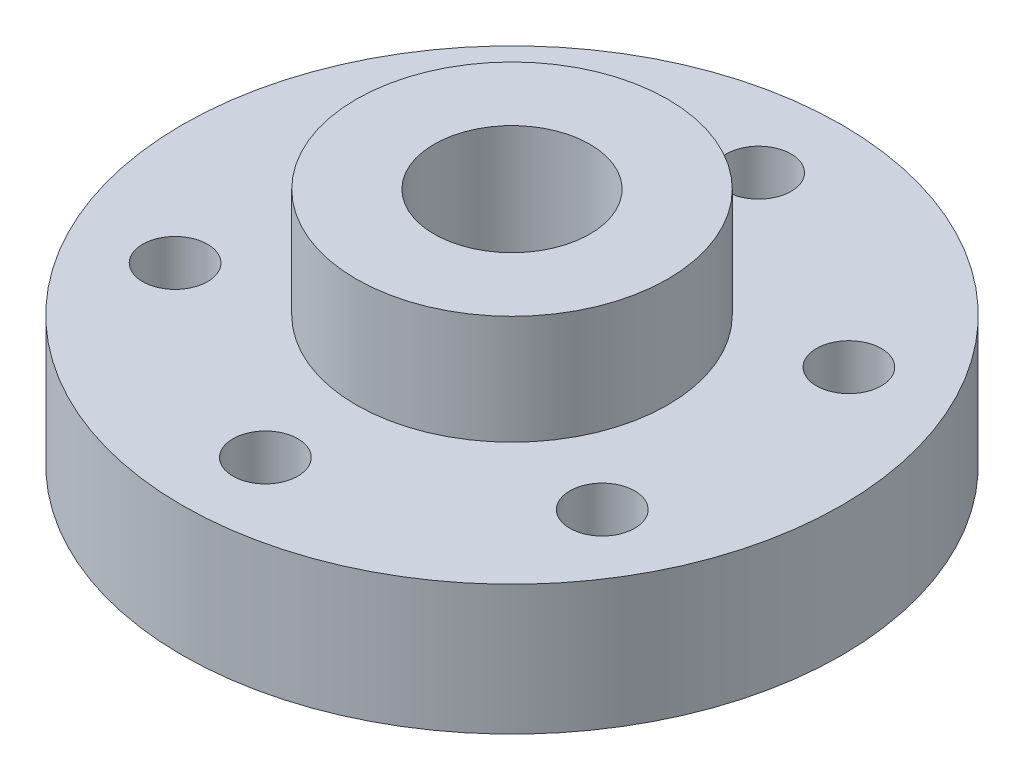
ISO-10303-21;
HEADER;
FILE_DESCRIPTION(('STEP AP214'),'2;1');
FILE_NAME('part.step','',(''),(''),'','','');
FILE_SCHEMA(('AUTOMOTIVE_DESIGN { 1 0 10303 214 1 1 1 1 }'));
ENDSEC;
DATA;
#1=APPLICATION_CONTEXT('core data for automotive mechanical design processes');
#2=APPLICATION_PROTOCOL_DEFINITION('international standard','automotive_design',2000,#1);
#3=PRODUCT_CONTEXT('',#1,'mechanical');
#4=PRODUCT('Part','Part','',(#3));
#5=PRODUCT_RELATED_PRODUCT_CATEGORY('part','',(#4));
#6=PRODUCT_DEFINITION_FORMATION('','',#4);
#7=PRODUCT_DEFINITION_CONTEXT('part definition',#1,'design');
#8=PRODUCT_DEFINITION('design','',#6,#7);
#9=PRODUCT_DEFINITION_SHAPE('','',#8);
#10=(LENGTH_UNIT() NAMED_UNIT(*) SI_UNIT(.MILLI.,.METRE.));
#11=(NAMED_UNIT(*) PLANE_ANGLE_UNIT() SI_UNIT($,.RADIAN.));
#12=(NAMED_UNIT(*) SI_UNIT($,.STERADIAN.) SOLID_ANGLE_UNIT());
#13=UNCERTAINTY_MEASURE_WITH_UNIT(LENGTH_MEASURE(1.E-05),#10,'distance_accuracy_value','');
#14=(GEOMETRIC_REPRESENTATION_CONTEXT(3) GLOBAL_UNCERTAINTY_ASSIGNED_CONTEXT((#13)) GLOBAL_UNIT_ASSIGNED_CONTEXT((#10,
#11,#12)) REPRESENTATION_CONTEXT('',''));
#15=CARTESIAN_POINT('',(0.,0.,0.));
#16=DIRECTION('',(0.,0.,1.));
#17=DIRECTION('',(1.,0.,0.));
#18=AXIS2_PLACEMENT_3D('',#15,#16,#17);
#19=CARTESIAN_POINT('',(0.,0.,0.));
#20=DIRECTION('',(0.,1.,0.));
#21=DIRECTION('',(0.,0.,1.));
#22=AXIS2_PLACEMENT_3D('',#19,#20,#21);
#23=PLANE('',#22);
#24=CARTESIAN_POINT('',(-8.2272413359519,0.,4.74999999999953));
#25=DIRECTION('',(0.,-1.,0.));
#26=DIRECTION('',(0.,0.,-1.));
#27=AXIS2_PLACEMENT_3D('',#24,#25,#26);
#28=CIRCLE('',#27,1.25000000000051);
#29=CARTESIAN_POINT('',(-8.2272413359519,0.,3.49999999999902));
#30=VERTEX_POINT('',#29);
#31=EDGE_CURVE('E75',#30,#30,#28,.T.);
#32=ORIENTED_EDGE('',*,*,#31,.F.);
#33=EDGE_LOOP('',(#32));
#34=FACE_BOUND('',#33,.T.);
#35=CARTESIAN_POINT('',(-8.22724133595136,0.,-4.75000000000047));
#36=DIRECTION('',(0.,-1.,0.));
#37=DIRECTION('',(0.,0.,-1.));
#38=AXIS2_PLACEMENT_3D('',#35,#36,#37);
#39=CIRCLE('',#38,1.250000000001);
#40=CARTESIAN_POINT('',(-8.22724133595136,0.,-6.00000000000147));
#41=VERTEX_POINT('',#40);
#42=EDGE_CURVE('E65',#41,#41,#39,.T.);
#43=ORIENTED_EDGE('',*,*,#42,.F.);
#44=EDGE_LOOP('',(#43));
#45=FACE_BOUND('',#44,.T.);
#46=CARTESIAN_POINT('',(1.07769812943697E-12,0.,-9.5));
#47=DIRECTION('',(0.,-1.,0.));
#48=DIRECTION('',(0.,0.,-1.));
#49=AXIS2_PLACEMENT_3D('',#46,#47,#48);
#50=CIRCLE('',#49,1.25000000000109);
#51=CARTESIAN_POINT('',(1.07769812943697E-12,0.,-10.7500000000011));
#52=VERTEX_POINT('',#51);
#53=EDGE_CURVE('E62',#52,#52,#50,.T.);
#54=ORIENTED_EDGE('',*,*,#53,.F.);
#55=EDGE_LOOP('',(#54));
#56=FACE_BOUND('',#55,.T.);
#57=CARTESIAN_POINT('',(8.22724133595298,0.,-4.74999999999953));
#58=DIRECTION('',(0.,-1.,0.));
#59=DIRECTION('',(0.,0.,-1.));
#60=AXIS2_PLACEMENT_3D('',#57,#58,#59);
#61=CIRCLE('',#60,1.25000000000068);
#62=CARTESIAN_POINT('',(8.22724133595298,0.,-6.00000000000021));
#63=VERTEX_POINT('',#62);
#64=EDGE_CURVE('E59',#63,#63,#61,.T.);
#65=ORIENTED_EDGE('',*,*,#64,.F.);
#66=EDGE_LOOP('',(#65));
#67=FACE_BOUND('',#66,.T.);
#68=CARTESIAN_POINT('',(8.22724133595243,0.,4.75000000000047));
#69=DIRECTION('',(0.,-1.,0.));
#70=DIRECTION('',(0.,0.,-1.));
#71=AXIS2_PLACEMENT_3D('',#68,#69,#70);
#72=CIRCLE('',#71,1.25000000000014);
#73=CARTESIAN_POINT('',(8.22724133595243,0.,3.50000000000032));
#74=VERTEX_POINT('',#73);
#75=EDGE_CURVE('E55',#74,#74,#72,.T.);
#76=ORIENTED_EDGE('',*,*,#75,.F.);
#77=EDGE_LOOP('',(#76));
#78=FACE_BOUND('',#77,.T.);
#79=CARTESIAN_POINT('',(0.,0.,9.5));
#80=DIRECTION('',(0.,-1.,0.));
#81=DIRECTION('',(0.,0.,-1.));
#82=AXIS2_PLACEMENT_3D('',#79,#80,#81);
#83=CIRCLE('',#82,1.25);
#84=CARTESIAN_POINT('',(0.,0.,8.25));
#85=VERTEX_POINT('',#84);
#86=EDGE_CURVE('E51',#85,#85,#83,.T.);
#87=ORIENTED_EDGE('',*,*,#86,.F.);
#88=EDGE_LOOP('',(#87));
#89=FACE_BOUND('',#88,.T.);
#90=CARTESIAN_POINT('',(0.,0.,0.));
#91=DIRECTION('',(0.,-1.,0.));
#92=DIRECTION('',(0.,0.,-1.));
#93=AXIS2_PLACEMENT_3D('',#90,#91,#92);
#94=CIRCLE('',#93,3.);
#95=CARTESIAN_POINT('',(0.,0.,-3.));
#96=VERTEX_POINT('',#95);
#97=EDGE_CURVE('E50',#96,#96,#94,.T.);
#98=ORIENTED_EDGE('',*,*,#97,.F.);
#99=EDGE_LOOP('',(#98));
#100=FACE_BOUND('',#99,.T.);
#101=CARTESIAN_POINT('',(0.,0.,0.));
#102=DIRECTION('',(0.,1.,0.));
#103=DIRECTION('',(0.,0.,1.));
#104=AXIS2_PLACEMENT_3D('',#101,#102,#103);
#105=CIRCLE('',#104,12.7);
#106=CARTESIAN_POINT('',(0.,0.,12.7));
#107=VERTEX_POINT('',#106);
#108=EDGE_CURVE('E10',#107,#107,#105,.T.);
#109=ORIENTED_EDGE('',*,*,#108,.F.);
#110=EDGE_LOOP('',(#109));
#111=FACE_BOUND('',#110,.T.);
#112=ADVANCED_FACE('F31',(#34,#45,#56,#67,#78,#89,#100,#111),#23,.F.);
#113=CARTESIAN_POINT('',(0.,9.2,0.));
#114=DIRECTION('',(0.,1.,0.));
#115=DIRECTION('',(0.,0.,1.));
#116=AXIS2_PLACEMENT_3D('',#113,#114,#115);
#117=CYLINDRICAL_SURFACE('',#116,12.7);
#118=CARTESIAN_POINT('',(0.,5.,0.));
#119=DIRECTION('',(0.,1.,0.));
#120=DIRECTION('',(0.,0.,1.));
#121=AXIS2_PLACEMENT_3D('',#118,#119,#120);
#122=CIRCLE('',#121,12.7);
#123=CARTESIAN_POINT('',(0.,5.,12.7));
#124=VERTEX_POINT('',#123);
#125=EDGE_CURVE('E38',#124,#124,#122,.T.);
#126=ORIENTED_EDGE('',*,*,#125,.F.);
#127=EDGE_LOOP('',(#126));
#128=FACE_BOUND('',#127,.T.);
#129=ORIENTED_EDGE('',*,*,#108,.T.);
#130=EDGE_LOOP('',(#129));
#131=FACE_BOUND('',#130,.T.);
#132=ADVANCED_FACE('F99',(#128,#131),#117,.T.);
#133=CARTESIAN_POINT('',(0.,5.,-12.7));
#134=DIRECTION('',(0.,-1.,0.));
#135=DIRECTION('',(0.,0.,-1.));
#136=AXIS2_PLACEMENT_3D('',#133,#134,#135);
#137=PLANE('',#136);
#138=CARTESIAN_POINT('',(-8.2272413359519,5.,4.74999999999953));
#139=DIRECTION('',(0.,-1.,0.));
#140=DIRECTION('',(0.,0.,-1.));
#141=AXIS2_PLACEMENT_3D('',#138,#139,#140);
#142=CIRCLE('',#141,1.25000000000051);
#143=CARTESIAN_POINT('',(-8.2272413359519,5.,3.49999999999902));
#144=VERTEX_POINT('',#143);
#145=EDGE_CURVE('E34',#144,#144,#142,.T.);
#146=ORIENTED_EDGE('',*,*,#145,.T.);
#147=EDGE_LOOP('',(#146));
#148=FACE_BOUND('',#147,.T.);
#149=CARTESIAN_POINT('',(-8.22724133595136,5.,-4.75000000000047));
#150=DIRECTION('',(0.,-1.,0.));
#151=DIRECTION('',(0.,0.,-1.));
#152=AXIS2_PLACEMENT_3D('',#149,#150,#151);
#153=CIRCLE('',#152,1.250000000001);
#154=CARTESIAN_POINT('',(-8.22724133595136,5.,-6.00000000000147));
#155=VERTEX_POINT('',#154);
#156=EDGE_CURVE('E63',#155,#155,#153,.T.);
#157=ORIENTED_EDGE('',*,*,#156,.T.);
#158=EDGE_LOOP('',(#157));
#159=FACE_BOUND('',#158,.T.);
#160=CARTESIAN_POINT('',(1.07769812943697E-12,5.,-9.5));
#161=DIRECTION('',(0.,-1.,0.));
#162=DIRECTION('',(0.,0.,-1.));
#163=AXIS2_PLACEMENT_3D('',#160,#161,#162);
#164=CIRCLE('',#163,1.25000000000109);
#165=CARTESIAN_POINT('',(1.07769812943697E-12,5.,-10.7500000000011));
#166=VERTEX_POINT('',#165);
#167=EDGE_CURVE('E60',#166,#166,#164,.T.);
#168=ORIENTED_EDGE('',*,*,#167,.T.);
#169=EDGE_LOOP('',(#168));
#170=FACE_BOUND('',#169,.T.);
#171=CARTESIAN_POINT('',(8.22724133595298,5.,-4.74999999999953));
#172=DIRECTION('',(0.,-1.,0.));
#173=DIRECTION('',(0.,0.,-1.));
#174=AXIS2_PLACEMENT_3D('',#171,#172,#173);
#175=CIRCLE('',#174,1.25000000000068);
#176=CARTESIAN_POINT('',(8.22724133595298,5.,-6.00000000000021));
#177=VERTEX_POINT('',#176);
#178=EDGE_CURVE('E56',#177,#177,#175,.T.);
#179=ORIENTED_EDGE('',*,*,#178,.T.);
#180=EDGE_LOOP('',(#179));
#181=FACE_BOUND('',#180,.T.);
#182=CARTESIAN_POINT('',(8.22724133595243,5.,4.75000000000047));
#183=DIRECTION('',(0.,-1.,0.));
#184=DIRECTION('',(0.,0.,-1.));
#185=AXIS2_PLACEMENT_3D('',#182,#183,#184);
#186=CIRCLE('',#185,1.25000000000014);
#187=CARTESIAN_POINT('',(8.22724133595243,5.,3.50000000000032));
#188=VERTEX_POINT('',#187);
#189=EDGE_CURVE('E52',#188,#188,#186,.T.);
#190=ORIENTED_EDGE('',*,*,#189,.T.);
#191=EDGE_LOOP('',(#190));
#192=FACE_BOUND('',#191,.T.);
#193=CARTESIAN_POINT('',(0.,5.,9.5));
#194=DIRECTION('',(0.,-1.,0.));
#195=DIRECTION('',(0.,0.,-1.));
#196=AXIS2_PLACEMENT_3D('',#193,#194,#195);
#197=CIRCLE('',#196,1.25);
#198=CARTESIAN_POINT('',(0.,5.,8.25));
#199=VERTEX_POINT('',#198);
#200=EDGE_CURVE('E47',#199,#199,#197,.T.);
#201=ORIENTED_EDGE('',*,*,#200,.T.);
#202=EDGE_LOOP('',(#201));
#203=FACE_BOUND('',#202,.T.);
#204=CARTESIAN_POINT('',(0.,5.,0.));
#205=DIRECTION('',(0.,1.,0.));
#206=DIRECTION('',(0.,0.,1.));
#207=AXIS2_PLACEMENT_3D('',#204,#205,#206);
#208=CIRCLE('',#207,6.);
#209=CARTESIAN_POINT('',(0.,5.,6.));
#210=VERTEX_POINT('',#209);
#211=EDGE_CURVE('E43',#210,#210,#208,.T.);
#212=ORIENTED_EDGE('',*,*,#211,.F.);
#213=EDGE_LOOP('',(#212));
#214=FACE_BOUND('',#213,.T.);
#215=ORIENTED_EDGE('',*,*,#125,.T.);
#216=EDGE_LOOP('',(#215));
#217=FACE_BOUND('',#216,.T.);
#218=ADVANCED_FACE('F96',(#148,#159,#170,#181,#192,#203,#214,#217),#137,.F.);
#219=CARTESIAN_POINT('',(0.,9.2,0.));
#220=DIRECTION('',(0.,1.,0.));
#221=DIRECTION('',(0.,0.,1.));
#222=AXIS2_PLACEMENT_3D('',#219,#220,#221);
#223=CYLINDRICAL_SURFACE('',#222,6.);
#224=CARTESIAN_POINT('',(0.,9.2,0.));
#225=DIRECTION('',(0.,1.,0.));
#226=DIRECTION('',(0.,0.,1.));
#227=AXIS2_PLACEMENT_3D('',#224,#225,#226);
#228=CIRCLE('',#227,6.);
#229=CARTESIAN_POINT('',(0.,9.2,6.));
#230=VERTEX_POINT('',#229);
#231=EDGE_CURVE('E87',#230,#230,#228,.T.);
#232=ORIENTED_EDGE('',*,*,#231,.F.);
#233=EDGE_LOOP('',(#232));
#234=FACE_BOUND('',#233,.T.);
#235=ORIENTED_EDGE('',*,*,#211,.T.);
#236=EDGE_LOOP('',(#235));
#237=FACE_BOUND('',#236,.T.);
#238=ADVANCED_FACE('F94',(#234,#237),#223,.T.);
#239=CARTESIAN_POINT('',(0.,9.2,-6.));
#240=DIRECTION('',(0.,-1.,0.));
#241=DIRECTION('',(0.,0.,-1.));
#242=AXIS2_PLACEMENT_3D('',#239,#240,#241);
#243=PLANE('',#242);
#244=CARTESIAN_POINT('',(0.,9.2,0.));
#245=DIRECTION('',(0.,-1.,0.));
#246=DIRECTION('',(0.,0.,-1.));
#247=AXIS2_PLACEMENT_3D('',#244,#245,#246);
#248=CIRCLE('',#247,3.);
#249=CARTESIAN_POINT('',(0.,9.2,-3.));
#250=VERTEX_POINT('',#249);
#251=EDGE_CURVE('E84',#250,#250,#248,.T.);
#252=ORIENTED_EDGE('',*,*,#251,.T.);
#253=EDGE_LOOP('',(#252));
#254=FACE_BOUND('',#253,.T.);
#255=ORIENTED_EDGE('',*,*,#231,.T.);
#256=EDGE_LOOP('',(#255));
#257=FACE_BOUND('',#256,.T.);
#258=ADVANCED_FACE('F112',(#254,#257),#243,.F.);
#259=CARTESIAN_POINT('',(0.,9.2,0.));
#260=DIRECTION('',(0.,-1.,0.));
#261=DIRECTION('',(0.,0.,-1.));
#262=AXIS2_PLACEMENT_3D('',#259,#260,#261);
#263=CYLINDRICAL_SURFACE('',#262,3.);
#264=ORIENTED_EDGE('',*,*,#251,.F.);
#265=EDGE_LOOP('',(#264));
#266=FACE_BOUND('',#265,.T.);
#267=ORIENTED_EDGE('',*,*,#97,.T.);
#268=EDGE_LOOP('',(#267));
#269=FACE_BOUND('',#268,.T.);
#270=ADVANCED_FACE('F116',(#266,#269),#263,.F.);
#271=CARTESIAN_POINT('',(0.,9.2,9.5));
#272=DIRECTION('',(0.,-1.,0.));
#273=DIRECTION('',(0.,0.,-1.));
#274=AXIS2_PLACEMENT_3D('',#271,#272,#273);
#275=CYLINDRICAL_SURFACE('',#274,1.25);
#276=ORIENTED_EDGE('',*,*,#86,.T.);
#277=EDGE_LOOP('',(#276));
#278=FACE_BOUND('',#277,.T.);
#279=ORIENTED_EDGE('',*,*,#200,.F.);
#280=EDGE_LOOP('',(#279));
#281=FACE_BOUND('',#280,.T.);
#282=ADVANCED_FACE('F120',(#278,#281),#275,.F.);
#283=CARTESIAN_POINT('',(8.22724133595243,9.2,4.75000000000047));
#284=DIRECTION('',(0.,-1.,0.));
#285=DIRECTION('',(0.,0.,-1.));
#286=AXIS2_PLACEMENT_3D('',#283,#284,#285);
#287=CYLINDRICAL_SURFACE('',#286,1.25000000000014);
#288=ORIENTED_EDGE('',*,*,#75,.T.);
#289=EDGE_LOOP('',(#288));
#290=FACE_BOUND('',#289,.T.);
#291=ORIENTED_EDGE('',*,*,#189,.F.);
#292=EDGE_LOOP('',(#291));
#293=FACE_BOUND('',#292,.T.);
#294=ADVANCED_FACE('F124',(#290,#293),#287,.F.);
#295=CARTESIAN_POINT('',(8.22724133595298,9.2,-4.74999999999953));
#296=DIRECTION('',(0.,-1.,0.));
#297=DIRECTION('',(0.,0.,-1.));
#298=AXIS2_PLACEMENT_3D('',#295,#296,#297);
#299=CYLINDRICAL_SURFACE('',#298,1.25000000000068);
#300=ORIENTED_EDGE('',*,*,#64,.T.);
#301=EDGE_LOOP('',(#300));
#302=FACE_BOUND('',#301,.T.);
#303=ORIENTED_EDGE('',*,*,#178,.F.);
#304=EDGE_LOOP('',(#303));
#305=FACE_BOUND('',#304,.T.);
#306=ADVANCED_FACE('F128',(#302,#305),#299,.F.);
#307=CARTESIAN_POINT('',(1.07769812943697E-12,9.2,-9.5));
#308=DIRECTION('',(0.,-1.,0.));
#309=DIRECTION('',(0.,0.,-1.));
#310=AXIS2_PLACEMENT_3D('',#307,#308,#309);
#311=CYLINDRICAL_SURFACE('',#310,1.25000000000109);
#312=ORIENTED_EDGE('',*,*,#53,.T.);
#313=EDGE_LOOP('',(#312));
#314=FACE_BOUND('',#313,.T.);
#315=ORIENTED_EDGE('',*,*,#167,.F.);
#316=EDGE_LOOP('',(#315));
#317=FACE_BOUND('',#316,.T.);
#318=ADVANCED_FACE('F132',(#314,#317),#311,.F.);
#319=CARTESIAN_POINT('',(-8.22724133595136,9.2,-4.75000000000047));
#320=DIRECTION('',(0.,-1.,0.));
#321=DIRECTION('',(0.,0.,-1.));
#322=AXIS2_PLACEMENT_3D('',#319,#320,#321);
#323=CYLINDRICAL_SURFACE('',#322,1.250000000001);
#324=ORIENTED_EDGE('',*,*,#42,.T.);
#325=EDGE_LOOP('',(#324));
#326=FACE_BOUND('',#325,.T.);
#327=ORIENTED_EDGE('',*,*,#156,.F.);
#328=EDGE_LOOP('',(#327));
#329=FACE_BOUND('',#328,.T.);
#330=ADVANCED_FACE('F136',(#326,#329),#323,.F.);
#331=CARTESIAN_POINT('',(-8.2272413359519,9.2,4.74999999999953));
#332=DIRECTION('',(0.,-1.,0.));
#333=DIRECTION('',(0.,0.,-1.));
#334=AXIS2_PLACEMENT_3D('',#331,#332,#333);
#335=CYLINDRICAL_SURFACE('',#334,1.25000000000051);
#336=ORIENTED_EDGE('',*,*,#31,.T.);
#337=EDGE_LOOP('',(#336));
#338=FACE_BOUND('',#337,.T.);
#339=ORIENTED_EDGE('',*,*,#145,.F.);
#340=EDGE_LOOP('',(#339));
#341=FACE_BOUND('',#340,.T.);
#342=ADVANCED_FACE('F140',(#338,#341),#335,.F.);
#343=CLOSED_SHELL('',(#112,#132,#218,#238,#258,#270,#282,#294,#306,#318,#330,#342));
#344=MANIFOLD_SOLID_BREP('B2',#343);
#345=ADVANCED_BREP_SHAPE_REPRESENTATION('',(#18,#344),#14);
#346=SHAPE_DEFINITION_REPRESENTATION(#9,#345);
ENDSEC;
END-ISO-10303-21;
